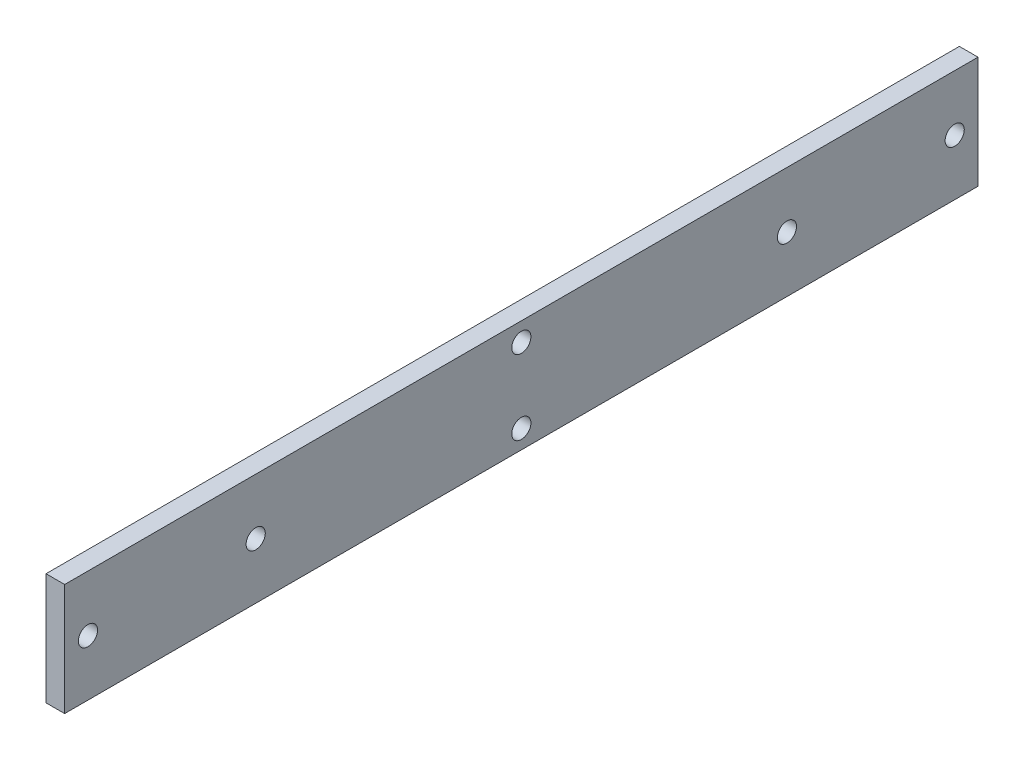
ISO-10303-21;
HEADER;
FILE_DESCRIPTION(('STEP AP214'),'2;1');
FILE_NAME('part.step','',(''),(''),'','','');
FILE_SCHEMA(('AUTOMOTIVE_DESIGN { 1 0 10303 214 1 1 1 1 }'));
ENDSEC;
DATA;
#1=APPLICATION_CONTEXT('core data for automotive mechanical design processes');
#2=APPLICATION_PROTOCOL_DEFINITION('international standard','automotive_design',2000,#1);
#3=PRODUCT_CONTEXT('',#1,'mechanical');
#4=PRODUCT('Part','Part','',(#3));
#5=PRODUCT_RELATED_PRODUCT_CATEGORY('part','',(#4));
#6=PRODUCT_DEFINITION_FORMATION('','',#4);
#7=PRODUCT_DEFINITION_CONTEXT('part definition',#1,'design');
#8=PRODUCT_DEFINITION('design','',#6,#7);
#9=PRODUCT_DEFINITION_SHAPE('','',#8);
#10=(LENGTH_UNIT() NAMED_UNIT(*) SI_UNIT(.MILLI.,.METRE.));
#11=(NAMED_UNIT(*) PLANE_ANGLE_UNIT() SI_UNIT($,.RADIAN.));
#12=(NAMED_UNIT(*) SI_UNIT($,.STERADIAN.) SOLID_ANGLE_UNIT());
#13=UNCERTAINTY_MEASURE_WITH_UNIT(LENGTH_MEASURE(1.E-05),#10,'distance_accuracy_value','');
#14=(GEOMETRIC_REPRESENTATION_CONTEXT(3) GLOBAL_UNCERTAINTY_ASSIGNED_CONTEXT((#13)) GLOBAL_UNIT_ASSIGNED_CONTEXT((#10,
#11,#12)) REPRESENTATION_CONTEXT('',''));
#15=CARTESIAN_POINT('',(0.,0.,0.));
#16=DIRECTION('',(0.,0.,1.));
#17=DIRECTION('',(1.,0.,0.));
#18=AXIS2_PLACEMENT_3D('',#15,#16,#17);
#19=CARTESIAN_POINT('',(3.175,-19.05,155.575));
#20=DIRECTION('',(-1.,0.,0.));
#21=DIRECTION('',(0.,0.,1.));
#22=AXIS2_PLACEMENT_3D('',#19,#20,#21);
#23=PLANE('',#22);
#24=CARTESIAN_POINT('',(3.175,0.,147.6375));
#25=DIRECTION('',(1.,0.,0.));
#26=DIRECTION('',(0.,0.,-1.));
#27=AXIS2_PLACEMENT_3D('',#24,#25,#26);
#28=CIRCLE('',#27,3.26389999999999);
#29=CARTESIAN_POINT('',(3.175,0.,144.3736));
#30=VERTEX_POINT('',#29);
#31=EDGE_CURVE('E156',#30,#30,#28,.T.);
#32=ORIENTED_EDGE('',*,*,#31,.F.);
#33=EDGE_LOOP('',(#32));
#34=FACE_BOUND('',#33,.T.);
#35=CARTESIAN_POINT('',(3.175,0.,90.4875));
#36=DIRECTION('',(1.,0.,0.));
#37=DIRECTION('',(0.,0.,-1.));
#38=AXIS2_PLACEMENT_3D('',#35,#36,#37);
#39=CIRCLE('',#38,3.26389999999999);
#40=CARTESIAN_POINT('',(3.175,0.,87.2236));
#41=VERTEX_POINT('',#40);
#42=EDGE_CURVE('E150',#41,#41,#39,.T.);
#43=ORIENTED_EDGE('',*,*,#42,.F.);
#44=EDGE_LOOP('',(#43));
#45=FACE_BOUND('',#44,.T.);
#46=CARTESIAN_POINT('',(3.175,0.,-90.4875));
#47=DIRECTION('',(1.,0.,0.));
#48=DIRECTION('',(0.,0.,-1.));
#49=AXIS2_PLACEMENT_3D('',#46,#47,#48);
#50=CIRCLE('',#49,3.26389999999999);
#51=CARTESIAN_POINT('',(3.175,0.,-93.7514));
#52=VERTEX_POINT('',#51);
#53=EDGE_CURVE('E144',#52,#52,#50,.T.);
#54=ORIENTED_EDGE('',*,*,#53,.F.);
#55=EDGE_LOOP('',(#54));
#56=FACE_BOUND('',#55,.T.);
#57=CARTESIAN_POINT('',(3.175,0.,-147.6375));
#58=DIRECTION('',(1.,0.,0.));
#59=DIRECTION('',(0.,0.,-1.));
#60=AXIS2_PLACEMENT_3D('',#57,#58,#59);
#61=CIRCLE('',#60,3.26389999999999);
#62=CARTESIAN_POINT('',(3.175,0.,-150.9014));
#63=VERTEX_POINT('',#62);
#64=EDGE_CURVE('E138',#63,#63,#61,.T.);
#65=ORIENTED_EDGE('',*,*,#64,.F.);
#66=EDGE_LOOP('',(#65));
#67=FACE_BOUND('',#66,.T.);
#68=CARTESIAN_POINT('',(3.175,12.7,0.));
#69=DIRECTION('',(1.,0.,0.));
#70=DIRECTION('',(0.,0.,-1.));
#71=AXIS2_PLACEMENT_3D('',#68,#69,#70);
#72=CIRCLE('',#71,3.26389999999999);
#73=CARTESIAN_POINT('',(3.175,12.7,-3.26389999999999));
#74=VERTEX_POINT('',#73);
#75=EDGE_CURVE('E132',#74,#74,#72,.T.);
#76=ORIENTED_EDGE('',*,*,#75,.F.);
#77=EDGE_LOOP('',(#76));
#78=FACE_BOUND('',#77,.T.);
#79=CARTESIAN_POINT('',(3.175,-12.7,0.));
#80=DIRECTION('',(1.,0.,0.));
#81=DIRECTION('',(0.,0.,-1.));
#82=AXIS2_PLACEMENT_3D('',#79,#80,#81);
#83=CIRCLE('',#82,3.26389999999999);
#84=CARTESIAN_POINT('',(3.175,-12.7,-3.26389999999999));
#85=VERTEX_POINT('',#84);
#86=EDGE_CURVE('E124',#85,#85,#83,.T.);
#87=ORIENTED_EDGE('',*,*,#86,.F.);
#88=EDGE_LOOP('',(#87));
#89=FACE_BOUND('',#88,.T.);
#90=DIRECTION('',(0.,1.,0.));
#91=VECTOR('',#90,1.);
#92=CARTESIAN_POINT('',(3.175,-19.05,-155.575));
#93=LINE('',#92,#91);
#94=CARTESIAN_POINT('',(3.175,-19.05,-155.575));
#95=VERTEX_POINT('',#94);
#96=CARTESIAN_POINT('',(3.175,19.05,-155.575));
#97=VERTEX_POINT('',#96);
#98=EDGE_CURVE('E104',#95,#97,#93,.T.);
#99=ORIENTED_EDGE('',*,*,#98,.T.);
#100=DIRECTION('',(0.,0.,-1.));
#101=VECTOR('',#100,1.);
#102=CARTESIAN_POINT('',(3.175,19.05,155.575));
#103=LINE('',#102,#101);
#104=CARTESIAN_POINT('',(3.175,19.05,155.575));
#105=VERTEX_POINT('',#104);
#106=EDGE_CURVE('E11',#105,#97,#103,.T.);
#107=ORIENTED_EDGE('',*,*,#106,.F.);
#108=DIRECTION('',(0.,1.,0.));
#109=VECTOR('',#108,1.);
#110=CARTESIAN_POINT('',(3.175,-19.05,155.575));
#111=LINE('',#110,#109);
#112=CARTESIAN_POINT('',(3.175,-19.05,155.575));
#113=VERTEX_POINT('',#112);
#114=EDGE_CURVE('E91',#113,#105,#111,.T.);
#115=ORIENTED_EDGE('',*,*,#114,.F.);
#116=DIRECTION('',(0.,0.,-1.));
#117=VECTOR('',#116,1.);
#118=CARTESIAN_POINT('',(3.175,-19.05,155.575));
#119=LINE('',#118,#117);
#120=EDGE_CURVE('E100',#113,#95,#119,.T.);
#121=ORIENTED_EDGE('',*,*,#120,.T.);
#122=EDGE_LOOP('',(#99,#107,#115,#121));
#123=FACE_BOUND('',#122,.T.);
#124=ADVANCED_FACE('F39',(#34,#45,#56,#67,#78,#89,#123),#23,.F.);
#125=CARTESIAN_POINT('',(-3.175,19.05,155.575));
#126=DIRECTION('',(0.,-1.,0.));
#127=DIRECTION('',(0.,0.,-1.));
#128=AXIS2_PLACEMENT_3D('',#125,#126,#127);
#129=PLANE('',#128);
#130=DIRECTION('',(-1.,0.,0.));
#131=VECTOR('',#130,1.);
#132=CARTESIAN_POINT('',(-3.175,19.05,-155.575));
#133=LINE('',#132,#131);
#134=CARTESIAN_POINT('',(-3.175,19.05,-155.575));
#135=VERTEX_POINT('',#134);
#136=EDGE_CURVE('E95',#97,#135,#133,.T.);
#137=ORIENTED_EDGE('',*,*,#136,.T.);
#138=DIRECTION('',(0.,0.,-1.));
#139=VECTOR('',#138,1.);
#140=CARTESIAN_POINT('',(-3.175,19.05,155.575));
#141=LINE('',#140,#139);
#142=CARTESIAN_POINT('',(-3.175,19.05,155.575));
#143=VERTEX_POINT('',#142);
#144=EDGE_CURVE('E48',#143,#135,#141,.T.);
#145=ORIENTED_EDGE('',*,*,#144,.F.);
#146=DIRECTION('',(-1.,0.,0.));
#147=VECTOR('',#146,1.);
#148=CARTESIAN_POINT('',(-3.175,19.05,155.575));
#149=LINE('',#148,#147);
#150=EDGE_CURVE('E86',#105,#143,#149,.T.);
#151=ORIENTED_EDGE('',*,*,#150,.F.);
#152=ORIENTED_EDGE('',*,*,#106,.T.);
#153=EDGE_LOOP('',(#137,#145,#151,#152));
#154=FACE_BOUND('',#153,.T.);
#155=ADVANCED_FACE('F94',(#154),#129,.F.);
#156=CARTESIAN_POINT('',(-3.175,-19.05,155.575));
#157=DIRECTION('',(1.,0.,0.));
#158=DIRECTION('',(0.,0.,-1.));
#159=AXIS2_PLACEMENT_3D('',#156,#157,#158);
#160=PLANE('',#159);
#161=CARTESIAN_POINT('',(-3.17499999999999,0.,147.6375));
#162=DIRECTION('',(1.,0.,0.));
#163=DIRECTION('',(0.,0.,-1.));
#164=AXIS2_PLACEMENT_3D('',#161,#162,#163);
#165=CIRCLE('',#164,3.26389999999999);
#166=CARTESIAN_POINT('',(-3.17499999999999,0.,144.3736));
#167=VERTEX_POINT('',#166);
#168=EDGE_CURVE('E153',#167,#167,#165,.T.);
#169=ORIENTED_EDGE('',*,*,#168,.T.);
#170=EDGE_LOOP('',(#169));
#171=FACE_BOUND('',#170,.T.);
#172=CARTESIAN_POINT('',(-3.17499999999999,0.,90.4875));
#173=DIRECTION('',(1.,0.,0.));
#174=DIRECTION('',(0.,0.,-1.));
#175=AXIS2_PLACEMENT_3D('',#172,#173,#174);
#176=CIRCLE('',#175,3.26389999999999);
#177=CARTESIAN_POINT('',(-3.17499999999999,0.,87.2236));
#178=VERTEX_POINT('',#177);
#179=EDGE_CURVE('E147',#178,#178,#176,.T.);
#180=ORIENTED_EDGE('',*,*,#179,.T.);
#181=EDGE_LOOP('',(#180));
#182=FACE_BOUND('',#181,.T.);
#183=CARTESIAN_POINT('',(-3.17499999999999,0.,-90.4875));
#184=DIRECTION('',(1.,0.,0.));
#185=DIRECTION('',(0.,0.,-1.));
#186=AXIS2_PLACEMENT_3D('',#183,#184,#185);
#187=CIRCLE('',#186,3.26389999999999);
#188=CARTESIAN_POINT('',(-3.17499999999999,0.,-93.7514));
#189=VERTEX_POINT('',#188);
#190=EDGE_CURVE('E141',#189,#189,#187,.T.);
#191=ORIENTED_EDGE('',*,*,#190,.T.);
#192=EDGE_LOOP('',(#191));
#193=FACE_BOUND('',#192,.T.);
#194=CARTESIAN_POINT('',(-3.17499999999999,0.,-147.6375));
#195=DIRECTION('',(1.,0.,0.));
#196=DIRECTION('',(0.,0.,-1.));
#197=AXIS2_PLACEMENT_3D('',#194,#195,#196);
#198=CIRCLE('',#197,3.26389999999999);
#199=CARTESIAN_POINT('',(-3.17499999999999,0.,-150.9014));
#200=VERTEX_POINT('',#199);
#201=EDGE_CURVE('E135',#200,#200,#198,.T.);
#202=ORIENTED_EDGE('',*,*,#201,.T.);
#203=EDGE_LOOP('',(#202));
#204=FACE_BOUND('',#203,.T.);
#205=CARTESIAN_POINT('',(-3.17499999999999,12.7,0.));
#206=DIRECTION('',(1.,0.,0.));
#207=DIRECTION('',(0.,0.,-1.));
#208=AXIS2_PLACEMENT_3D('',#205,#206,#207);
#209=CIRCLE('',#208,3.26389999999999);
#210=CARTESIAN_POINT('',(-3.17499999999999,12.7,-3.26389999999999));
#211=VERTEX_POINT('',#210);
#212=EDGE_CURVE('E128',#211,#211,#209,.T.);
#213=ORIENTED_EDGE('',*,*,#212,.T.);
#214=EDGE_LOOP('',(#213));
#215=FACE_BOUND('',#214,.T.);
#216=CARTESIAN_POINT('',(-3.17499999999999,-12.7,0.));
#217=DIRECTION('',(1.,0.,0.));
#218=DIRECTION('',(0.,0.,-1.));
#219=AXIS2_PLACEMENT_3D('',#216,#217,#218);
#220=CIRCLE('',#219,3.26389999999999);
#221=CARTESIAN_POINT('',(-3.17499999999999,-12.7,-3.26389999999999));
#222=VERTEX_POINT('',#221);
#223=EDGE_CURVE('E107',#222,#222,#220,.T.);
#224=ORIENTED_EDGE('',*,*,#223,.T.);
#225=EDGE_LOOP('',(#224));
#226=FACE_BOUND('',#225,.T.);
#227=DIRECTION('',(0.,-1.,0.));
#228=VECTOR('',#227,1.);
#229=CARTESIAN_POINT('',(-3.175,-19.05,-155.575));
#230=LINE('',#229,#228);
#231=CARTESIAN_POINT('',(-3.175,-19.05,-155.575));
#232=VERTEX_POINT('',#231);
#233=EDGE_CURVE('E73',#135,#232,#230,.T.);
#234=ORIENTED_EDGE('',*,*,#233,.T.);
#235=DIRECTION('',(0.,0.,-1.));
#236=VECTOR('',#235,1.);
#237=CARTESIAN_POINT('',(-3.175,-19.05,155.575));
#238=LINE('',#237,#236);
#239=CARTESIAN_POINT('',(-3.175,-19.05,155.575));
#240=VERTEX_POINT('',#239);
#241=EDGE_CURVE('E97',#240,#232,#238,.T.);
#242=ORIENTED_EDGE('',*,*,#241,.F.);
#243=DIRECTION('',(0.,-1.,0.));
#244=VECTOR('',#243,1.);
#245=CARTESIAN_POINT('',(-3.175,-19.05,155.575));
#246=LINE('',#245,#244);
#247=EDGE_CURVE('E89',#143,#240,#246,.T.);
#248=ORIENTED_EDGE('',*,*,#247,.F.);
#249=ORIENTED_EDGE('',*,*,#144,.T.);
#250=EDGE_LOOP('',(#234,#242,#248,#249));
#251=FACE_BOUND('',#250,.T.);
#252=ADVANCED_FACE('F98',(#171,#182,#193,#204,#215,#226,#251),#160,.F.);
#253=CARTESIAN_POINT('',(-3.175,-19.05,155.575));
#254=DIRECTION('',(0.,1.,0.));
#255=DIRECTION('',(0.,0.,1.));
#256=AXIS2_PLACEMENT_3D('',#253,#254,#255);
#257=PLANE('',#256);
#258=DIRECTION('',(1.,0.,0.));
#259=VECTOR('',#258,1.);
#260=CARTESIAN_POINT('',(-3.175,-19.05,-155.575));
#261=LINE('',#260,#259);
#262=EDGE_CURVE('E79',#232,#95,#261,.T.);
#263=ORIENTED_EDGE('',*,*,#262,.T.);
#264=ORIENTED_EDGE('',*,*,#120,.F.);
#265=DIRECTION('',(1.,0.,0.));
#266=VECTOR('',#265,1.);
#267=CARTESIAN_POINT('',(-3.175,-19.05,155.575));
#268=LINE('',#267,#266);
#269=EDGE_CURVE('E56',#240,#113,#268,.T.);
#270=ORIENTED_EDGE('',*,*,#269,.F.);
#271=ORIENTED_EDGE('',*,*,#241,.T.);
#272=EDGE_LOOP('',(#263,#264,#270,#271));
#273=FACE_BOUND('',#272,.T.);
#274=ADVANCED_FACE('F115',(#273),#257,.F.);
#275=CARTESIAN_POINT('',(0.,0.,155.575));
#276=DIRECTION('',(0.,0.,-1.));
#277=DIRECTION('',(-1.,0.,0.));
#278=AXIS2_PLACEMENT_3D('',#275,#276,#277);
#279=PLANE('',#278);
#280=ORIENTED_EDGE('',*,*,#114,.T.);
#281=ORIENTED_EDGE('',*,*,#150,.T.);
#282=ORIENTED_EDGE('',*,*,#247,.T.);
#283=ORIENTED_EDGE('',*,*,#269,.T.);
#284=EDGE_LOOP('',(#280,#281,#282,#283));
#285=FACE_BOUND('',#284,.T.);
#286=ADVANCED_FACE('F87',(#285),#279,.F.);
#287=CARTESIAN_POINT('',(0.,0.,-155.575));
#288=DIRECTION('',(0.,0.,-1.));
#289=DIRECTION('',(-1.,0.,0.));
#290=AXIS2_PLACEMENT_3D('',#287,#288,#289);
#291=PLANE('',#290);
#292=ORIENTED_EDGE('',*,*,#98,.F.);
#293=ORIENTED_EDGE('',*,*,#262,.F.);
#294=ORIENTED_EDGE('',*,*,#233,.F.);
#295=ORIENTED_EDGE('',*,*,#136,.F.);
#296=EDGE_LOOP('',(#292,#293,#294,#295));
#297=FACE_BOUND('',#296,.T.);
#298=ADVANCED_FACE('F118',(#297),#291,.T.);
#299=CARTESIAN_POINT('',(3.175,-12.7,0.));
#300=DIRECTION('',(1.,0.,0.));
#301=DIRECTION('',(0.,0.,-1.));
#302=AXIS2_PLACEMENT_3D('',#299,#300,#301);
#303=CYLINDRICAL_SURFACE('',#302,3.26389999999999);
#304=ORIENTED_EDGE('',*,*,#223,.F.);
#305=EDGE_LOOP('',(#304));
#306=FACE_BOUND('',#305,.T.);
#307=ORIENTED_EDGE('',*,*,#86,.T.);
#308=EDGE_LOOP('',(#307));
#309=FACE_BOUND('',#308,.T.);
#310=ADVANCED_FACE('F174',(#306,#309),#303,.F.);
#311=CARTESIAN_POINT('',(3.175,12.7,0.));
#312=DIRECTION('',(1.,0.,0.));
#313=DIRECTION('',(0.,0.,-1.));
#314=AXIS2_PLACEMENT_3D('',#311,#312,#313);
#315=CYLINDRICAL_SURFACE('',#314,3.26389999999999);
#316=ORIENTED_EDGE('',*,*,#212,.F.);
#317=EDGE_LOOP('',(#316));
#318=FACE_BOUND('',#317,.T.);
#319=ORIENTED_EDGE('',*,*,#75,.T.);
#320=EDGE_LOOP('',(#319));
#321=FACE_BOUND('',#320,.T.);
#322=ADVANCED_FACE('F176',(#318,#321),#315,.F.);
#323=CARTESIAN_POINT('',(3.175,0.,-147.6375));
#324=DIRECTION('',(1.,0.,0.));
#325=DIRECTION('',(0.,0.,-1.));
#326=AXIS2_PLACEMENT_3D('',#323,#324,#325);
#327=CYLINDRICAL_SURFACE('',#326,3.26389999999999);
#328=ORIENTED_EDGE('',*,*,#201,.F.);
#329=EDGE_LOOP('',(#328));
#330=FACE_BOUND('',#329,.T.);
#331=ORIENTED_EDGE('',*,*,#64,.T.);
#332=EDGE_LOOP('',(#331));
#333=FACE_BOUND('',#332,.T.);
#334=ADVANCED_FACE('F183',(#330,#333),#327,.F.);
#335=CARTESIAN_POINT('',(3.175,0.,-90.4875));
#336=DIRECTION('',(1.,0.,0.));
#337=DIRECTION('',(0.,0.,-1.));
#338=AXIS2_PLACEMENT_3D('',#335,#336,#337);
#339=CYLINDRICAL_SURFACE('',#338,3.26389999999999);
#340=ORIENTED_EDGE('',*,*,#190,.F.);
#341=EDGE_LOOP('',(#340));
#342=FACE_BOUND('',#341,.T.);
#343=ORIENTED_EDGE('',*,*,#53,.T.);
#344=EDGE_LOOP('',(#343));
#345=FACE_BOUND('',#344,.T.);
#346=ADVANCED_FACE('F244',(#342,#345),#339,.F.);
#347=CARTESIAN_POINT('',(3.175,0.,90.4875));
#348=DIRECTION('',(1.,0.,0.));
#349=DIRECTION('',(0.,0.,-1.));
#350=AXIS2_PLACEMENT_3D('',#347,#348,#349);
#351=CYLINDRICAL_SURFACE('',#350,3.26389999999999);
#352=ORIENTED_EDGE('',*,*,#179,.F.);
#353=EDGE_LOOP('',(#352));
#354=FACE_BOUND('',#353,.T.);
#355=ORIENTED_EDGE('',*,*,#42,.T.);
#356=EDGE_LOOP('',(#355));
#357=FACE_BOUND('',#356,.T.);
#358=ADVANCED_FACE('F253',(#354,#357),#351,.F.);
#359=CARTESIAN_POINT('',(3.175,0.,147.6375));
#360=DIRECTION('',(1.,0.,0.));
#361=DIRECTION('',(0.,0.,-1.));
#362=AXIS2_PLACEMENT_3D('',#359,#360,#361);
#363=CYLINDRICAL_SURFACE('',#362,3.26389999999999);
#364=ORIENTED_EDGE('',*,*,#168,.F.);
#365=EDGE_LOOP('',(#364));
#366=FACE_BOUND('',#365,.T.);
#367=ORIENTED_EDGE('',*,*,#31,.T.);
#368=EDGE_LOOP('',(#367));
#369=FACE_BOUND('',#368,.T.);
#370=ADVANCED_FACE('F160',(#366,#369),#363,.F.);
#371=CLOSED_SHELL('',(#124,#155,#252,#274,#286,#298,#310,#322,#334,#346,#358,#370));
#372=MANIFOLD_SOLID_BREP('B2',#371);
#373=ADVANCED_BREP_SHAPE_REPRESENTATION('',(#18,#372),#14);
#374=SHAPE_DEFINITION_REPRESENTATION(#9,#373);
ENDSEC;
END-ISO-10303-21;
